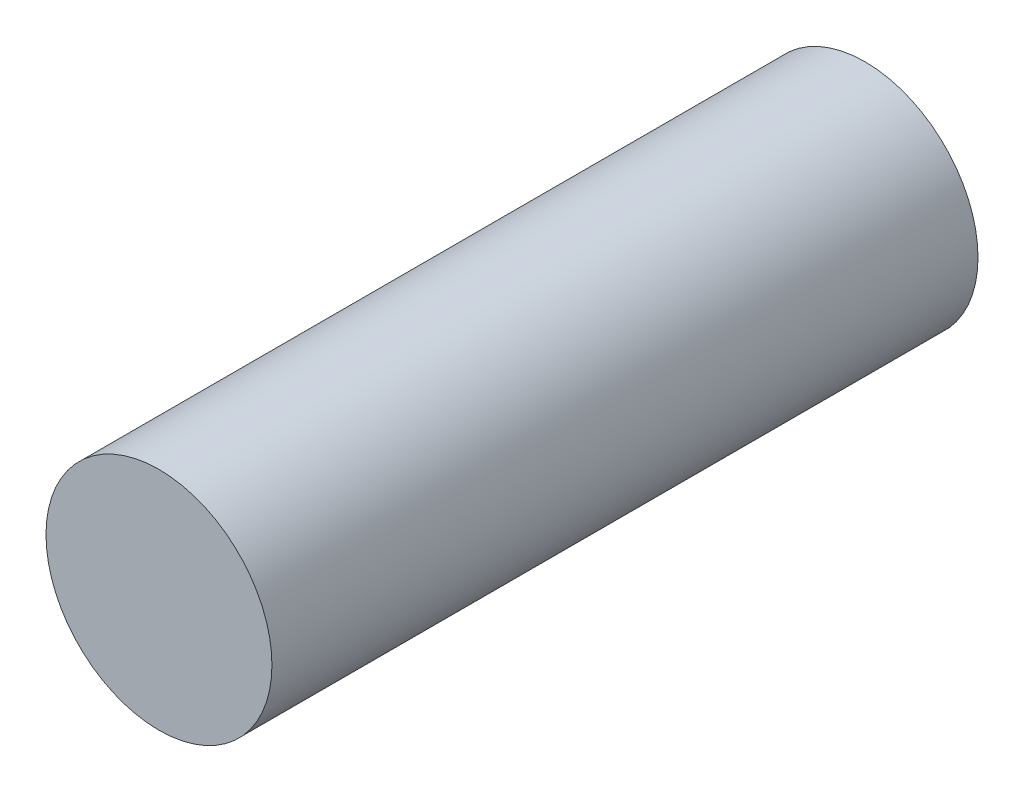
ISO-10303-21;
HEADER;
FILE_DESCRIPTION(('STEP AP214'),'2;1');
FILE_NAME('part.step','',(''),(''),'','','');
FILE_SCHEMA(('AUTOMOTIVE_DESIGN { 1 0 10303 214 1 1 1 1 }'));
ENDSEC;
DATA;
#1=APPLICATION_CONTEXT('core data for automotive mechanical design processes');
#2=APPLICATION_PROTOCOL_DEFINITION('international standard','automotive_design',2000,#1);
#3=PRODUCT_CONTEXT('',#1,'mechanical');
#4=PRODUCT('Part','Part','',(#3));
#5=PRODUCT_RELATED_PRODUCT_CATEGORY('part','',(#4));
#6=PRODUCT_DEFINITION_FORMATION('','',#4);
#7=PRODUCT_DEFINITION_CONTEXT('part definition',#1,'design');
#8=PRODUCT_DEFINITION('design','',#6,#7);
#9=PRODUCT_DEFINITION_SHAPE('','',#8);
#10=(LENGTH_UNIT() NAMED_UNIT(*) SI_UNIT(.MILLI.,.METRE.));
#11=(NAMED_UNIT(*) PLANE_ANGLE_UNIT() SI_UNIT($,.RADIAN.));
#12=(NAMED_UNIT(*) SI_UNIT($,.STERADIAN.) SOLID_ANGLE_UNIT());
#13=UNCERTAINTY_MEASURE_WITH_UNIT(LENGTH_MEASURE(1.E-05),#10,'distance_accuracy_value','');
#14=(GEOMETRIC_REPRESENTATION_CONTEXT(3) GLOBAL_UNCERTAINTY_ASSIGNED_CONTEXT((#13)) GLOBAL_UNIT_ASSIGNED_CONTEXT((#10,
#11,#12)) REPRESENTATION_CONTEXT('',''));
#15=CARTESIAN_POINT('',(0.,0.,0.));
#16=DIRECTION('',(0.,0.,1.));
#17=DIRECTION('',(1.,0.,0.));
#18=AXIS2_PLACEMENT_3D('',#15,#16,#17);
#19=CARTESIAN_POINT('',(0.,-175.,12.5));
#20=DIRECTION('',(0.,0.,-1.));
#21=DIRECTION('',(-1.,0.,0.));
#22=AXIS2_PLACEMENT_3D('',#19,#20,#21);
#23=CYLINDRICAL_SURFACE('',#22,4.);
#24=CARTESIAN_POINT('',(0.,-175.,12.5));
#25=DIRECTION('',(0.,0.,1.));
#26=DIRECTION('',(1.,0.,0.));
#27=AXIS2_PLACEMENT_3D('',#24,#25,#26);
#28=CIRCLE('',#27,4.);
#29=CARTESIAN_POINT('',(4.00000000000001,-175.,12.5));
#30=VERTEX_POINT('',#29);
#31=EDGE_CURVE('E10',#30,#30,#28,.T.);
#32=ORIENTED_EDGE('',*,*,#31,.F.);
#33=EDGE_LOOP('',(#32));
#34=FACE_BOUND('',#33,.T.);
#35=CARTESIAN_POINT('',(0.,-175.,-12.5));
#36=DIRECTION('',(0.,0.,1.));
#37=DIRECTION('',(1.,0.,0.));
#38=AXIS2_PLACEMENT_3D('',#35,#36,#37);
#39=CIRCLE('',#38,4.);
#40=CARTESIAN_POINT('',(4.00000000000001,-175.,-12.5));
#41=VERTEX_POINT('',#40);
#42=EDGE_CURVE('E37',#41,#41,#39,.T.);
#43=ORIENTED_EDGE('',*,*,#42,.T.);
#44=EDGE_LOOP('',(#43));
#45=FACE_BOUND('',#44,.T.);
#46=ADVANCED_FACE('F34',(#34,#45),#23,.T.);
#47=CARTESIAN_POINT('',(0.,-175.,12.5));
#48=DIRECTION('',(0.,0.,1.));
#49=DIRECTION('',(1.,0.,0.));
#50=AXIS2_PLACEMENT_3D('',#47,#48,#49);
#51=PLANE('',#50);
#52=ORIENTED_EDGE('',*,*,#31,.T.);
#53=EDGE_LOOP('',(#52));
#54=FACE_BOUND('',#53,.T.);
#55=ADVANCED_FACE('F49',(#54),#51,.T.);
#56=CARTESIAN_POINT('',(0.,-175.,-12.5));
#57=DIRECTION('',(0.,0.,1.));
#58=DIRECTION('',(1.,0.,0.));
#59=AXIS2_PLACEMENT_3D('',#56,#57,#58);
#60=PLANE('',#59);
#61=ORIENTED_EDGE('',*,*,#42,.F.);
#62=EDGE_LOOP('',(#61));
#63=FACE_BOUND('',#62,.T.);
#64=ADVANCED_FACE('F47',(#63),#60,.F.);
#65=CLOSED_SHELL('',(#46,#55,#64));
#66=MANIFOLD_SOLID_BREP('B2',#65);
#67=ADVANCED_BREP_SHAPE_REPRESENTATION('',(#18,#66),#14);
#68=SHAPE_DEFINITION_REPRESENTATION(#9,#67);
ENDSEC;
END-ISO-10303-21;
